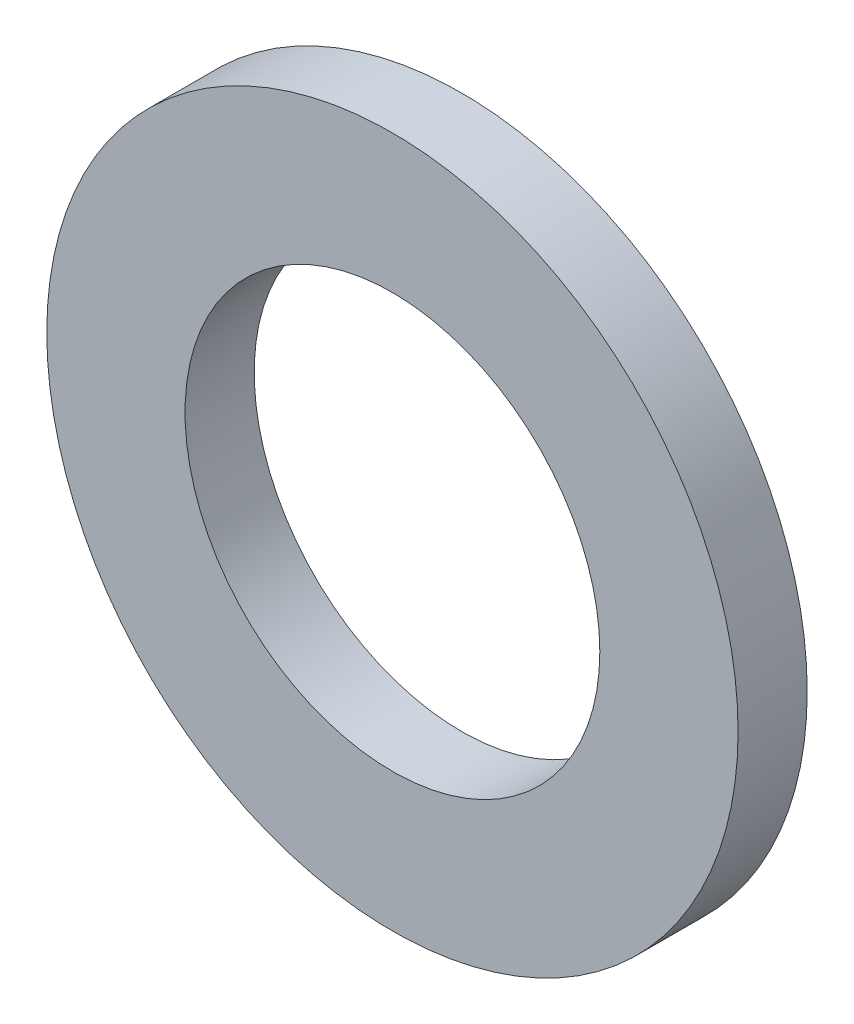
ISO-10303-21;
HEADER;
FILE_DESCRIPTION(('STEP AP214'),'2;1');
FILE_NAME('part.step','',(''),(''),'','','');
FILE_SCHEMA(('AUTOMOTIVE_DESIGN { 1 0 10303 214 1 1 1 1 }'));
ENDSEC;
DATA;
#1=APPLICATION_CONTEXT('core data for automotive mechanical design processes');
#2=APPLICATION_PROTOCOL_DEFINITION('international standard','automotive_design',2000,#1);
#3=PRODUCT_CONTEXT('',#1,'mechanical');
#4=PRODUCT('Part','Part','',(#3));
#5=PRODUCT_RELATED_PRODUCT_CATEGORY('part','',(#4));
#6=PRODUCT_DEFINITION_FORMATION('','',#4);
#7=PRODUCT_DEFINITION_CONTEXT('part definition',#1,'design');
#8=PRODUCT_DEFINITION('design','',#6,#7);
#9=PRODUCT_DEFINITION_SHAPE('','',#8);
#10=(LENGTH_UNIT() NAMED_UNIT(*) SI_UNIT(.MILLI.,.METRE.));
#11=(NAMED_UNIT(*) PLANE_ANGLE_UNIT() SI_UNIT($,.RADIAN.));
#12=(NAMED_UNIT(*) SI_UNIT($,.STERADIAN.) SOLID_ANGLE_UNIT());
#13=UNCERTAINTY_MEASURE_WITH_UNIT(LENGTH_MEASURE(1.E-05),#10,'distance_accuracy_value','');
#14=(GEOMETRIC_REPRESENTATION_CONTEXT(3) GLOBAL_UNCERTAINTY_ASSIGNED_CONTEXT((#13)) GLOBAL_UNIT_ASSIGNED_CONTEXT((#10,
#11,#12)) REPRESENTATION_CONTEXT('',''));
#15=CARTESIAN_POINT('',(0.,0.,0.));
#16=DIRECTION('',(0.,0.,1.));
#17=DIRECTION('',(1.,0.,0.));
#18=AXIS2_PLACEMENT_3D('',#15,#16,#17);
#19=CARTESIAN_POINT('',(0.,0.,0.8));
#20=DIRECTION('',(0.,0.,1.));
#21=DIRECTION('',(1.,0.,0.));
#22=AXIS2_PLACEMENT_3D('',#19,#20,#21);
#23=PLANE('',#22);
#24=CARTESIAN_POINT('',(0.,0.,0.8));
#25=DIRECTION('',(0.,0.,1.));
#26=DIRECTION('',(1.,0.,0.));
#27=AXIS2_PLACEMENT_3D('',#24,#25,#26);
#28=CIRCLE('',#27,4.);
#29=CARTESIAN_POINT('',(4.,0.,0.8));
#30=VERTEX_POINT('',#29);
#31=EDGE_CURVE('E10',#30,#30,#28,.T.);
#32=ORIENTED_EDGE('',*,*,#31,.T.);
#33=EDGE_LOOP('',(#32));
#34=FACE_BOUND('',#33,.T.);
#35=CARTESIAN_POINT('',(0.,0.,0.8));
#36=DIRECTION('',(0.,0.,1.));
#37=DIRECTION('',(1.,0.,0.));
#38=AXIS2_PLACEMENT_3D('',#35,#36,#37);
#39=CIRCLE('',#38,2.4);
#40=CARTESIAN_POINT('',(2.4,0.,0.8));
#41=VERTEX_POINT('',#40);
#42=EDGE_CURVE('E42',#41,#41,#39,.T.);
#43=ORIENTED_EDGE('',*,*,#42,.F.);
#44=EDGE_LOOP('',(#43));
#45=FACE_BOUND('',#44,.T.);
#46=ADVANCED_FACE('F31',(#34,#45),#23,.T.);
#47=CARTESIAN_POINT('',(0.,0.,0.));
#48=DIRECTION('',(0.,0.,1.));
#49=DIRECTION('',(1.,0.,0.));
#50=AXIS2_PLACEMENT_3D('',#47,#48,#49);
#51=PLANE('',#50);
#52=CARTESIAN_POINT('',(0.,0.,0.));
#53=DIRECTION('',(0.,0.,1.));
#54=DIRECTION('',(1.,0.,0.));
#55=AXIS2_PLACEMENT_3D('',#52,#53,#54);
#56=CIRCLE('',#55,4.);
#57=CARTESIAN_POINT('',(4.,0.,0.));
#58=VERTEX_POINT('',#57);
#59=EDGE_CURVE('E35',#58,#58,#56,.T.);
#60=ORIENTED_EDGE('',*,*,#59,.F.);
#61=EDGE_LOOP('',(#60));
#62=FACE_BOUND('',#61,.T.);
#63=CARTESIAN_POINT('',(0.,0.,0.));
#64=DIRECTION('',(0.,0.,1.));
#65=DIRECTION('',(1.,0.,0.));
#66=AXIS2_PLACEMENT_3D('',#63,#64,#65);
#67=CIRCLE('',#66,2.4);
#68=CARTESIAN_POINT('',(2.4,0.,0.));
#69=VERTEX_POINT('',#68);
#70=EDGE_CURVE('E44',#69,#69,#67,.T.);
#71=ORIENTED_EDGE('',*,*,#70,.T.);
#72=EDGE_LOOP('',(#71));
#73=FACE_BOUND('',#72,.T.);
#74=ADVANCED_FACE('F54',(#62,#73),#51,.F.);
#75=CARTESIAN_POINT('',(0.,0.,0.8));
#76=DIRECTION('',(0.,0.,-1.));
#77=DIRECTION('',(-1.,0.,0.));
#78=AXIS2_PLACEMENT_3D('',#75,#76,#77);
#79=CYLINDRICAL_SURFACE('',#78,4.);
#80=ORIENTED_EDGE('',*,*,#31,.F.);
#81=EDGE_LOOP('',(#80));
#82=FACE_BOUND('',#81,.T.);
#83=ORIENTED_EDGE('',*,*,#59,.T.);
#84=EDGE_LOOP('',(#83));
#85=FACE_BOUND('',#84,.T.);
#86=ADVANCED_FACE('F33',(#82,#85),#79,.T.);
#87=CARTESIAN_POINT('',(0.,0.,0.8));
#88=DIRECTION('',(0.,0.,-1.));
#89=DIRECTION('',(-1.,0.,0.));
#90=AXIS2_PLACEMENT_3D('',#87,#88,#89);
#91=CYLINDRICAL_SURFACE('',#90,2.4);
#92=ORIENTED_EDGE('',*,*,#42,.T.);
#93=EDGE_LOOP('',(#92));
#94=FACE_BOUND('',#93,.T.);
#95=ORIENTED_EDGE('',*,*,#70,.F.);
#96=EDGE_LOOP('',(#95));
#97=FACE_BOUND('',#96,.T.);
#98=ADVANCED_FACE('F50',(#94,#97),#91,.F.);
#99=CLOSED_SHELL('',(#46,#74,#86,#98));
#100=MANIFOLD_SOLID_BREP('B2',#99);
#101=ADVANCED_BREP_SHAPE_REPRESENTATION('',(#18,#100),#14);
#102=SHAPE_DEFINITION_REPRESENTATION(#9,#101);
ENDSEC;
END-ISO-10303-21;
